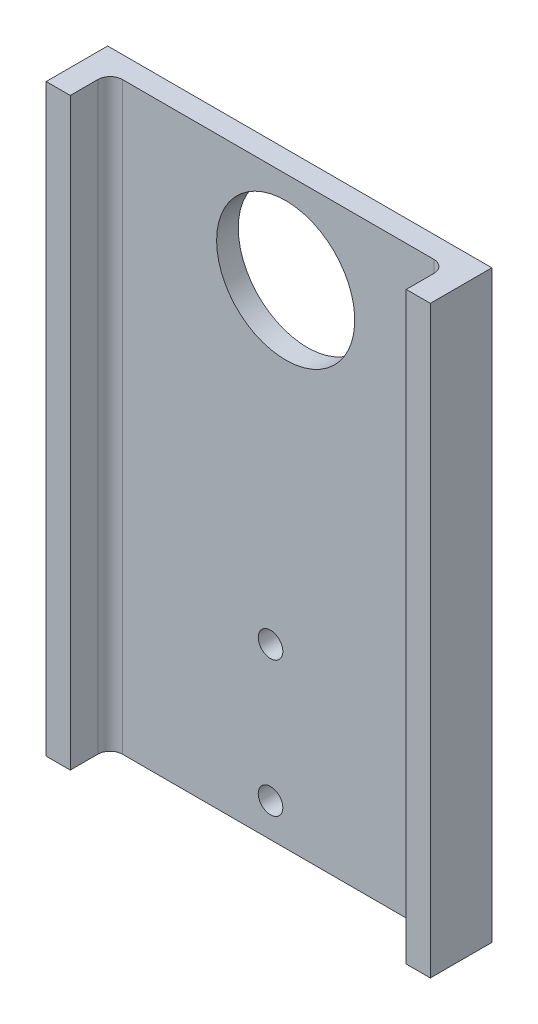
ISO-10303-21;
HEADER;
FILE_DESCRIPTION(('STEP AP214'),'2;1');
FILE_NAME('part.step','',(''),(''),'','','');
FILE_SCHEMA(('AUTOMOTIVE_DESIGN { 1 0 10303 214 1 1 1 1 }'));
ENDSEC;
DATA;
#1=APPLICATION_CONTEXT('core data for automotive mechanical design processes');
#2=APPLICATION_PROTOCOL_DEFINITION('international standard','automotive_design',2000,#1);
#3=PRODUCT_CONTEXT('',#1,'mechanical');
#4=PRODUCT('Part','Part','',(#3));
#5=PRODUCT_RELATED_PRODUCT_CATEGORY('part','',(#4));
#6=PRODUCT_DEFINITION_FORMATION('','',#4);
#7=PRODUCT_DEFINITION_CONTEXT('part definition',#1,'design');
#8=PRODUCT_DEFINITION('design','',#6,#7);
#9=PRODUCT_DEFINITION_SHAPE('','',#8);
#10=(LENGTH_UNIT() NAMED_UNIT(*) SI_UNIT(.MILLI.,.METRE.));
#11=(NAMED_UNIT(*) PLANE_ANGLE_UNIT() SI_UNIT($,.RADIAN.));
#12=(NAMED_UNIT(*) SI_UNIT($,.STERADIAN.) SOLID_ANGLE_UNIT());
#13=UNCERTAINTY_MEASURE_WITH_UNIT(LENGTH_MEASURE(1.E-05),#10,'distance_accuracy_value','');
#14=(GEOMETRIC_REPRESENTATION_CONTEXT(3) GLOBAL_UNCERTAINTY_ASSIGNED_CONTEXT((#13)) GLOBAL_UNIT_ASSIGNED_CONTEXT((#10,
#11,#12)) REPRESENTATION_CONTEXT('',''));
#15=CARTESIAN_POINT('',(0.,0.,0.));
#16=DIRECTION('',(0.,0.,1.));
#17=DIRECTION('',(1.,0.,0.));
#18=AXIS2_PLACEMENT_3D('',#15,#16,#17);
#19=CARTESIAN_POINT('',(-38.1,120.65,12.7));
#20=DIRECTION('',(1.,0.,0.));
#21=DIRECTION('',(0.,0.,-1.));
#22=AXIS2_PLACEMENT_3D('',#19,#20,#21);
#23=PLANE('',#22);
#24=DIRECTION('',(0.,0.,1.));
#25=VECTOR('',#24,1.);
#26=CARTESIAN_POINT('',(-38.1,0.,12.7));
#27=LINE('',#26,#25);
#28=CARTESIAN_POINT('',(-38.1,0.,0.));
#29=VERTEX_POINT('',#28);
#30=CARTESIAN_POINT('',(-38.1,0.,12.7));
#31=VERTEX_POINT('',#30);
#32=EDGE_CURVE('E193',#29,#31,#27,.T.);
#33=ORIENTED_EDGE('',*,*,#32,.T.);
#34=DIRECTION('',(0.,-1.,0.));
#35=VECTOR('',#34,1.);
#36=CARTESIAN_POINT('',(-38.1,120.65,12.7));
#37=LINE('',#36,#35);
#38=CARTESIAN_POINT('',(-38.1,120.65,12.7));
#39=VERTEX_POINT('',#38);
#40=EDGE_CURVE('E115',#39,#31,#37,.T.);
#41=ORIENTED_EDGE('',*,*,#40,.F.);
#42=DIRECTION('',(0.,0.,1.));
#43=VECTOR('',#42,1.);
#44=CARTESIAN_POINT('',(-38.1,120.65,12.7));
#45=LINE('',#44,#43);
#46=CARTESIAN_POINT('',(-38.1,120.65,0.));
#47=VERTEX_POINT('',#46);
#48=EDGE_CURVE('E110',#47,#39,#45,.T.);
#49=ORIENTED_EDGE('',*,*,#48,.F.);
#50=DIRECTION('',(0.,-1.,0.));
#51=VECTOR('',#50,1.);
#52=CARTESIAN_POINT('',(-38.1,120.65,0.));
#53=LINE('',#52,#51);
#54=EDGE_CURVE('E113',#47,#29,#53,.T.);
#55=ORIENTED_EDGE('',*,*,#54,.T.);
#56=EDGE_LOOP('',(#33,#41,#49,#55));
#57=FACE_BOUND('',#56,.T.);
#58=ADVANCED_FACE('F33',(#57),#23,.F.);
#59=CARTESIAN_POINT('',(-33.1216,120.65,12.7));
#60=DIRECTION('',(0.,0.,-1.));
#61=DIRECTION('',(-1.,0.,0.));
#62=AXIS2_PLACEMENT_3D('',#59,#60,#61);
#63=PLANE('',#62);
#64=DIRECTION('',(1.,0.,0.));
#65=VECTOR('',#64,1.);
#66=CARTESIAN_POINT('',(-33.1216,0.,12.7));
#67=LINE('',#66,#65);
#68=CARTESIAN_POINT('',(-33.1216,0.,12.7));
#69=VERTEX_POINT('',#68);
#70=EDGE_CURVE('E192',#31,#69,#67,.T.);
#71=ORIENTED_EDGE('',*,*,#70,.T.);
#72=DIRECTION('',(0.,-1.,0.));
#73=VECTOR('',#72,1.);
#74=CARTESIAN_POINT('',(-33.1216,120.65,12.7));
#75=LINE('',#74,#73);
#76=CARTESIAN_POINT('',(-33.1216,120.65,12.7));
#77=VERTEX_POINT('',#76);
#78=EDGE_CURVE('E138',#77,#69,#75,.T.);
#79=ORIENTED_EDGE('',*,*,#78,.F.);
#80=DIRECTION('',(1.,0.,0.));
#81=VECTOR('',#80,1.);
#82=CARTESIAN_POINT('',(-33.1216,120.65,12.7));
#83=LINE('',#82,#81);
#84=EDGE_CURVE('E118',#39,#77,#83,.T.);
#85=ORIENTED_EDGE('',*,*,#84,.F.);
#86=ORIENTED_EDGE('',*,*,#40,.T.);
#87=EDGE_LOOP('',(#71,#79,#85,#86));
#88=FACE_BOUND('',#87,.T.);
#89=ADVANCED_FACE('F250',(#88),#63,.F.);
#90=CARTESIAN_POINT('',(-33.1216,120.65,4.4704));
#91=DIRECTION('',(-1.,0.,0.));
#92=DIRECTION('',(0.,0.,1.));
#93=AXIS2_PLACEMENT_3D('',#90,#91,#92);
#94=PLANE('',#93);
#95=DIRECTION('',(0.,0.,-1.));
#96=VECTOR('',#95,1.);
#97=CARTESIAN_POINT('',(-33.1216,0.,4.4704));
#98=LINE('',#97,#96);
#99=CARTESIAN_POINT('',(-33.1216,0.,7.0104));
#100=VERTEX_POINT('',#99);
#101=EDGE_CURVE('E168',#69,#100,#98,.T.);
#102=ORIENTED_EDGE('',*,*,#101,.T.);
#103=DIRECTION('',(0.,-1.,0.));
#104=VECTOR('',#103,1.);
#105=CARTESIAN_POINT('',(-33.1216,120.65,7.0104));
#106=LINE('',#105,#104);
#107=CARTESIAN_POINT('',(-33.1216,120.65,7.0104));
#108=VERTEX_POINT('',#107);
#109=EDGE_CURVE('E136',#100,#108,#106,.F.);
#110=ORIENTED_EDGE('',*,*,#109,.T.);
#111=DIRECTION('',(0.,0.,-1.));
#112=VECTOR('',#111,1.);
#113=CARTESIAN_POINT('',(-33.1216,120.65,4.4704));
#114=LINE('',#113,#112);
#115=EDGE_CURVE('E189',#77,#108,#114,.T.);
#116=ORIENTED_EDGE('',*,*,#115,.F.);
#117=ORIENTED_EDGE('',*,*,#78,.T.);
#118=EDGE_LOOP('',(#102,#110,#116,#117));
#119=FACE_BOUND('',#118,.T.);
#120=ADVANCED_FACE('F186',(#119),#94,.F.);
#121=CARTESIAN_POINT('',(36.2481188582486,120.65,4.47039999999999));
#122=DIRECTION('',(0.,0.,-1.));
#123=DIRECTION('',(-1.,0.,0.));
#124=AXIS2_PLACEMENT_3D('',#121,#122,#123);
#125=PLANE('',#124);
#126=CARTESIAN_POINT('',(0.,6.985,4.47039999999999));
#127=DIRECTION('',(0.,0.,-1.));
#128=DIRECTION('',(-1.,0.,0.));
#129=AXIS2_PLACEMENT_3D('',#126,#127,#128);
#130=CIRCLE('',#129,2.54);
#131=CARTESIAN_POINT('',(-2.54,6.985,4.47039999999999));
#132=VERTEX_POINT('',#131);
#133=EDGE_CURVE('E217',#132,#132,#130,.T.);
#134=ORIENTED_EDGE('',*,*,#133,.T.);
#135=EDGE_LOOP('',(#134));
#136=FACE_BOUND('',#135,.T.);
#137=CARTESIAN_POINT('',(0.,34.925,4.47039999999999));
#138=DIRECTION('',(0.,0.,-1.));
#139=DIRECTION('',(-1.,0.,0.));
#140=AXIS2_PLACEMENT_3D('',#137,#138,#139);
#141=CIRCLE('',#140,2.54);
#142=CARTESIAN_POINT('',(-2.54,34.925,4.47039999999999));
#143=VERTEX_POINT('',#142);
#144=EDGE_CURVE('E211',#143,#143,#141,.T.);
#145=ORIENTED_EDGE('',*,*,#144,.T.);
#146=EDGE_LOOP('',(#145));
#147=FACE_BOUND('',#146,.T.);
#148=CARTESIAN_POINT('',(3.12651885824855,101.6,4.47039999999999));
#149=DIRECTION('',(0.,0.,-1.));
#150=DIRECTION('',(-1.,0.,0.));
#151=AXIS2_PLACEMENT_3D('',#148,#149,#150);
#152=CIRCLE('',#151,14.2621);
#153=CARTESIAN_POINT('',(-11.1355811417514,101.6,4.47039999999999));
#154=VERTEX_POINT('',#153);
#155=EDGE_CURVE('E197',#154,#154,#152,.T.);
#156=ORIENTED_EDGE('',*,*,#155,.T.);
#157=EDGE_LOOP('',(#156));
#158=FACE_BOUND('',#157,.T.);
#159=DIRECTION('',(1.,0.,0.));
#160=VECTOR('',#159,1.);
#161=CARTESIAN_POINT('',(36.2481188582486,0.,4.47039999999999));
#162=LINE('',#161,#160);
#163=CARTESIAN_POINT('',(-30.5816,0.,4.4704));
#164=VERTEX_POINT('',#163);
#165=CARTESIAN_POINT('',(33.7081188582486,0.,4.47039999999999));
#166=VERTEX_POINT('',#165);
#167=EDGE_CURVE('E164',#164,#166,#162,.T.);
#168=ORIENTED_EDGE('',*,*,#167,.T.);
#169=DIRECTION('',(0.,-1.,0.));
#170=VECTOR('',#169,1.);
#171=CARTESIAN_POINT('',(33.7081188582486,120.65,4.47039999999999));
#172=LINE('',#171,#170);
#173=CARTESIAN_POINT('',(33.7081188582486,120.65,4.47039999999999));
#174=VERTEX_POINT('',#173);
#175=EDGE_CURVE('E54',#166,#174,#172,.F.);
#176=ORIENTED_EDGE('',*,*,#175,.T.);
#177=DIRECTION('',(1.,0.,0.));
#178=VECTOR('',#177,1.);
#179=CARTESIAN_POINT('',(0.,120.65,4.47039999999999));
#180=LINE('',#179,#178);
#181=CARTESIAN_POINT('',(-30.5816,120.65,4.4704));
#182=VERTEX_POINT('',#181);
#183=EDGE_CURVE('E202',#182,#174,#180,.T.);
#184=ORIENTED_EDGE('',*,*,#183,.F.);
#185=DIRECTION('',(0.,-1.,0.));
#186=VECTOR('',#185,1.);
#187=CARTESIAN_POINT('',(-30.5816,0.,4.4704));
#188=LINE('',#187,#186);
#189=EDGE_CURVE('E133',#182,#164,#188,.T.);
#190=ORIENTED_EDGE('',*,*,#189,.T.);
#191=EDGE_LOOP('',(#168,#176,#184,#190));
#192=FACE_BOUND('',#191,.T.);
#193=ADVANCED_FACE('F242',(#136,#147,#158,#192),#125,.F.);
#194=CARTESIAN_POINT('',(36.2481188582486,120.65,12.7));
#195=DIRECTION('',(1.,0.,0.));
#196=DIRECTION('',(0.,0.,-1.));
#197=AXIS2_PLACEMENT_3D('',#194,#195,#196);
#198=PLANE('',#197);
#199=DIRECTION('',(0.,0.,1.));
#200=VECTOR('',#199,1.);
#201=CARTESIAN_POINT('',(36.2481188582486,120.65,12.7));
#202=LINE('',#201,#200);
#203=CARTESIAN_POINT('',(36.2481188582486,120.65,7.01039999999999));
#204=VERTEX_POINT('',#203);
#205=CARTESIAN_POINT('',(36.2481188582486,120.65,12.7));
#206=VERTEX_POINT('',#205);
#207=EDGE_CURVE('E157',#204,#206,#202,.T.);
#208=ORIENTED_EDGE('',*,*,#207,.F.);
#209=DIRECTION('',(0.,-1.,0.));
#210=VECTOR('',#209,1.);
#211=CARTESIAN_POINT('',(36.2481188582486,0.,7.01039999999999));
#212=LINE('',#211,#210);
#213=CARTESIAN_POINT('',(36.2481188582486,0.,7.01039999999999));
#214=VERTEX_POINT('',#213);
#215=EDGE_CURVE('E147',#204,#214,#212,.T.);
#216=ORIENTED_EDGE('',*,*,#215,.T.);
#217=DIRECTION('',(0.,0.,1.));
#218=VECTOR('',#217,1.);
#219=CARTESIAN_POINT('',(36.2481188582486,0.,12.7));
#220=LINE('',#219,#218);
#221=CARTESIAN_POINT('',(36.2481188582486,0.,12.7));
#222=VERTEX_POINT('',#221);
#223=EDGE_CURVE('E155',#214,#222,#220,.T.);
#224=ORIENTED_EDGE('',*,*,#223,.T.);
#225=DIRECTION('',(0.,-1.,0.));
#226=VECTOR('',#225,1.);
#227=CARTESIAN_POINT('',(36.2481188582486,120.65,12.7));
#228=LINE('',#227,#226);
#229=EDGE_CURVE('E179',#206,#222,#228,.T.);
#230=ORIENTED_EDGE('',*,*,#229,.F.);
#231=EDGE_LOOP('',(#208,#216,#224,#230));
#232=FACE_BOUND('',#231,.T.);
#233=ADVANCED_FACE('F153',(#232),#198,.F.);
#234=CARTESIAN_POINT('',(41.2265188582486,120.65,12.7));
#235=DIRECTION('',(0.,0.,-1.));
#236=DIRECTION('',(-1.,0.,0.));
#237=AXIS2_PLACEMENT_3D('',#234,#235,#236);
#238=PLANE('',#237);
#239=DIRECTION('',(1.,0.,0.));
#240=VECTOR('',#239,1.);
#241=CARTESIAN_POINT('',(41.2265188582486,0.,12.7));
#242=LINE('',#241,#240);
#243=CARTESIAN_POINT('',(41.2265188582486,0.,12.7));
#244=VERTEX_POINT('',#243);
#245=EDGE_CURVE('E163',#222,#244,#242,.T.);
#246=ORIENTED_EDGE('',*,*,#245,.T.);
#247=DIRECTION('',(0.,-1.,0.));
#248=VECTOR('',#247,1.);
#249=CARTESIAN_POINT('',(41.2265188582486,120.65,12.7));
#250=LINE('',#249,#248);
#251=CARTESIAN_POINT('',(41.2265188582486,120.65,12.7));
#252=VERTEX_POINT('',#251);
#253=EDGE_CURVE('E176',#252,#244,#250,.T.);
#254=ORIENTED_EDGE('',*,*,#253,.F.);
#255=DIRECTION('',(1.,0.,0.));
#256=VECTOR('',#255,1.);
#257=CARTESIAN_POINT('',(41.2265188582486,120.65,12.7));
#258=LINE('',#257,#256);
#259=EDGE_CURVE('E199',#206,#252,#258,.T.);
#260=ORIENTED_EDGE('',*,*,#259,.F.);
#261=ORIENTED_EDGE('',*,*,#229,.T.);
#262=EDGE_LOOP('',(#246,#254,#260,#261));
#263=FACE_BOUND('',#262,.T.);
#264=ADVANCED_FACE('F277',(#263),#238,.F.);
#265=CARTESIAN_POINT('',(41.2265188582486,120.65,0.));
#266=DIRECTION('',(-1.,0.,0.));
#267=DIRECTION('',(0.,0.,1.));
#268=AXIS2_PLACEMENT_3D('',#265,#266,#267);
#269=PLANE('',#268);
#270=DIRECTION('',(0.,0.,-1.));
#271=VECTOR('',#270,1.);
#272=CARTESIAN_POINT('',(41.2265188582486,0.,0.));
#273=LINE('',#272,#271);
#274=CARTESIAN_POINT('',(41.2265188582486,0.,0.));
#275=VERTEX_POINT('',#274);
#276=EDGE_CURVE('E166',#244,#275,#273,.T.);
#277=ORIENTED_EDGE('',*,*,#276,.T.);
#278=DIRECTION('',(0.,-1.,0.));
#279=VECTOR('',#278,1.);
#280=CARTESIAN_POINT('',(41.2265188582486,120.65,0.));
#281=LINE('',#280,#279);
#282=CARTESIAN_POINT('',(41.2265188582486,120.65,0.));
#283=VERTEX_POINT('',#282);
#284=EDGE_CURVE('E174',#283,#275,#281,.T.);
#285=ORIENTED_EDGE('',*,*,#284,.F.);
#286=DIRECTION('',(0.,0.,-1.));
#287=VECTOR('',#286,1.);
#288=CARTESIAN_POINT('',(41.2265188582486,120.65,0.));
#289=LINE('',#288,#287);
#290=EDGE_CURVE('E124',#252,#283,#289,.T.);
#291=ORIENTED_EDGE('',*,*,#290,.F.);
#292=ORIENTED_EDGE('',*,*,#253,.T.);
#293=EDGE_LOOP('',(#277,#285,#291,#292));
#294=FACE_BOUND('',#293,.T.);
#295=ADVANCED_FACE('F229',(#294),#269,.F.);
#296=CARTESIAN_POINT('',(0.,120.65,0.));
#297=DIRECTION('',(0.,0.,1.));
#298=DIRECTION('',(1.,0.,0.));
#299=AXIS2_PLACEMENT_3D('',#296,#297,#298);
#300=PLANE('',#299);
#301=CARTESIAN_POINT('',(0.,6.985,0.));
#302=DIRECTION('',(0.,0.,-1.));
#303=DIRECTION('',(-1.,0.,0.));
#304=AXIS2_PLACEMENT_3D('',#301,#302,#303);
#305=CIRCLE('',#304,2.54);
#306=CARTESIAN_POINT('',(-2.54,6.985,0.));
#307=VERTEX_POINT('',#306);
#308=EDGE_CURVE('E220',#307,#307,#305,.T.);
#309=ORIENTED_EDGE('',*,*,#308,.F.);
#310=EDGE_LOOP('',(#309));
#311=FACE_BOUND('',#310,.T.);
#312=CARTESIAN_POINT('',(0.,34.925,0.));
#313=DIRECTION('',(0.,0.,-1.));
#314=DIRECTION('',(-1.,0.,0.));
#315=AXIS2_PLACEMENT_3D('',#312,#313,#314);
#316=CIRCLE('',#315,2.54);
#317=CARTESIAN_POINT('',(-2.54,34.925,0.));
#318=VERTEX_POINT('',#317);
#319=EDGE_CURVE('E214',#318,#318,#316,.T.);
#320=ORIENTED_EDGE('',*,*,#319,.F.);
#321=EDGE_LOOP('',(#320));
#322=FACE_BOUND('',#321,.T.);
#323=CARTESIAN_POINT('',(3.12651885824855,101.6,0.));
#324=DIRECTION('',(0.,0.,-1.));
#325=DIRECTION('',(-1.,0.,0.));
#326=AXIS2_PLACEMENT_3D('',#323,#324,#325);
#327=CIRCLE('',#326,14.2621);
#328=CARTESIAN_POINT('',(-11.1355811417514,101.6,0.));
#329=VERTEX_POINT('',#328);
#330=EDGE_CURVE('E208',#329,#329,#327,.T.);
#331=ORIENTED_EDGE('',*,*,#330,.F.);
#332=EDGE_LOOP('',(#331));
#333=FACE_BOUND('',#332,.T.);
#334=DIRECTION('',(-1.,0.,0.));
#335=VECTOR('',#334,1.);
#336=CARTESIAN_POINT('',(0.,0.,0.));
#337=LINE('',#336,#335);
#338=EDGE_CURVE('E128',#275,#29,#337,.T.);
#339=ORIENTED_EDGE('',*,*,#338,.T.);
#340=ORIENTED_EDGE('',*,*,#54,.F.);
#341=DIRECTION('',(-1.,0.,0.));
#342=VECTOR('',#341,1.);
#343=CARTESIAN_POINT('',(-38.1,120.65,0.));
#344=LINE('',#343,#342);
#345=EDGE_CURVE('E119',#283,#47,#344,.T.);
#346=ORIENTED_EDGE('',*,*,#345,.F.);
#347=ORIENTED_EDGE('',*,*,#284,.T.);
#348=EDGE_LOOP('',(#339,#340,#346,#347));
#349=FACE_BOUND('',#348,.T.);
#350=ADVANCED_FACE('F130',(#311,#322,#333,#349),#300,.F.);
#351=CARTESIAN_POINT('',(0.,120.65,0.));
#352=DIRECTION('',(0.,-1.,0.));
#353=DIRECTION('',(0.,0.,-1.));
#354=AXIS2_PLACEMENT_3D('',#351,#352,#353);
#355=PLANE('',#354);
#356=ORIENTED_EDGE('',*,*,#345,.T.);
#357=ORIENTED_EDGE('',*,*,#48,.T.);
#358=ORIENTED_EDGE('',*,*,#84,.T.);
#359=ORIENTED_EDGE('',*,*,#115,.T.);
#360=CARTESIAN_POINT('',(-30.5816,120.65,7.0104));
#361=DIRECTION('',(0.,-1.,0.));
#362=DIRECTION('',(0.,0.,-1.));
#363=AXIS2_PLACEMENT_3D('',#360,#361,#362);
#364=CIRCLE('',#363,2.54);
#365=EDGE_CURVE('E145',#108,#182,#364,.T.);
#366=ORIENTED_EDGE('',*,*,#365,.T.);
#367=ORIENTED_EDGE('',*,*,#183,.T.);
#368=CARTESIAN_POINT('',(33.7081188582486,120.65,7.01039999999999));
#369=DIRECTION('',(0.,-1.,0.));
#370=DIRECTION('',(0.,0.,-1.));
#371=AXIS2_PLACEMENT_3D('',#368,#369,#370);
#372=CIRCLE('',#371,2.54);
#373=EDGE_CURVE('E11',#174,#204,#372,.T.);
#374=ORIENTED_EDGE('',*,*,#373,.T.);
#375=ORIENTED_EDGE('',*,*,#207,.T.);
#376=ORIENTED_EDGE('',*,*,#259,.T.);
#377=ORIENTED_EDGE('',*,*,#290,.T.);
#378=EDGE_LOOP('',(#356,#357,#358,#359,#366,#367,#374,#375,#376,#377));
#379=FACE_BOUND('',#378,.T.);
#380=ADVANCED_FACE('F122',(#379),#355,.F.);
#381=CARTESIAN_POINT('',(0.,0.,0.));
#382=DIRECTION('',(0.,-1.,0.));
#383=DIRECTION('',(0.,0.,-1.));
#384=AXIS2_PLACEMENT_3D('',#381,#382,#383);
#385=PLANE('',#384);
#386=ORIENTED_EDGE('',*,*,#32,.F.);
#387=ORIENTED_EDGE('',*,*,#338,.F.);
#388=ORIENTED_EDGE('',*,*,#276,.F.);
#389=ORIENTED_EDGE('',*,*,#245,.F.);
#390=ORIENTED_EDGE('',*,*,#223,.F.);
#391=CARTESIAN_POINT('',(33.7081188582486,0.,7.01039999999999));
#392=DIRECTION('',(0.,-1.,0.));
#393=DIRECTION('',(0.,0.,-1.));
#394=AXIS2_PLACEMENT_3D('',#391,#392,#393);
#395=CIRCLE('',#394,2.54);
#396=EDGE_CURVE('E41',#214,#166,#395,.F.);
#397=ORIENTED_EDGE('',*,*,#396,.T.);
#398=ORIENTED_EDGE('',*,*,#167,.F.);
#399=CARTESIAN_POINT('',(-30.5816,0.,7.0104));
#400=DIRECTION('',(0.,-1.,0.));
#401=DIRECTION('',(0.,0.,-1.));
#402=AXIS2_PLACEMENT_3D('',#399,#400,#401);
#403=CIRCLE('',#402,2.54);
#404=EDGE_CURVE('E143',#164,#100,#403,.F.);
#405=ORIENTED_EDGE('',*,*,#404,.T.);
#406=ORIENTED_EDGE('',*,*,#101,.F.);
#407=ORIENTED_EDGE('',*,*,#70,.F.);
#408=EDGE_LOOP('',(#386,#387,#388,#389,#390,#397,#398,#405,#406,#407));
#409=FACE_BOUND('',#408,.T.);
#410=ADVANCED_FACE('F161',(#409),#385,.T.);
#411=CARTESIAN_POINT('',(3.12651885824855,101.6,107.95));
#412=DIRECTION('',(0.,0.,-1.));
#413=DIRECTION('',(-1.,0.,0.));
#414=AXIS2_PLACEMENT_3D('',#411,#412,#413);
#415=CYLINDRICAL_SURFACE('',#414,14.2621);
#416=ORIENTED_EDGE('',*,*,#330,.T.);
#417=EDGE_LOOP('',(#416));
#418=FACE_BOUND('',#417,.T.);
#419=ORIENTED_EDGE('',*,*,#155,.F.);
#420=EDGE_LOOP('',(#419));
#421=FACE_BOUND('',#420,.T.);
#422=ADVANCED_FACE('F235',(#418,#421),#415,.F.);
#423=CARTESIAN_POINT('',(0.,34.925,127.));
#424=DIRECTION('',(0.,0.,-1.));
#425=DIRECTION('',(-1.,0.,0.));
#426=AXIS2_PLACEMENT_3D('',#423,#424,#425);
#427=CYLINDRICAL_SURFACE('',#426,2.54);
#428=ORIENTED_EDGE('',*,*,#319,.T.);
#429=EDGE_LOOP('',(#428));
#430=FACE_BOUND('',#429,.T.);
#431=ORIENTED_EDGE('',*,*,#144,.F.);
#432=EDGE_LOOP('',(#431));
#433=FACE_BOUND('',#432,.T.);
#434=ADVANCED_FACE('F238',(#430,#433),#427,.F.);
#435=CARTESIAN_POINT('',(0.,6.985,127.));
#436=DIRECTION('',(0.,0.,-1.));
#437=DIRECTION('',(-1.,0.,0.));
#438=AXIS2_PLACEMENT_3D('',#435,#436,#437);
#439=CYLINDRICAL_SURFACE('',#438,2.54);
#440=ORIENTED_EDGE('',*,*,#308,.T.);
#441=EDGE_LOOP('',(#440));
#442=FACE_BOUND('',#441,.T.);
#443=ORIENTED_EDGE('',*,*,#133,.F.);
#444=EDGE_LOOP('',(#443));
#445=FACE_BOUND('',#444,.T.);
#446=ADVANCED_FACE('F224',(#442,#445),#439,.F.);
#447=CARTESIAN_POINT('',(-30.5816,120.65,7.0104));
#448=DIRECTION('',(0.,1.,0.));
#449=DIRECTION('',(0.,0.,1.));
#450=AXIS2_PLACEMENT_3D('',#447,#448,#449);
#451=CYLINDRICAL_SURFACE('',#450,2.54);
#452=ORIENTED_EDGE('',*,*,#365,.F.);
#453=ORIENTED_EDGE('',*,*,#109,.F.);
#454=ORIENTED_EDGE('',*,*,#404,.F.);
#455=ORIENTED_EDGE('',*,*,#189,.F.);
#456=EDGE_LOOP('',(#452,#453,#454,#455));
#457=FACE_BOUND('',#456,.T.);
#458=ADVANCED_FACE('F249',(#457),#451,.F.);
#459=CARTESIAN_POINT('',(33.7081188582486,120.65,7.01039999999999));
#460=DIRECTION('',(0.,1.,0.));
#461=DIRECTION('',(0.,0.,1.));
#462=AXIS2_PLACEMENT_3D('',#459,#460,#461);
#463=CYLINDRICAL_SURFACE('',#462,2.54);
#464=ORIENTED_EDGE('',*,*,#373,.F.);
#465=ORIENTED_EDGE('',*,*,#175,.F.);
#466=ORIENTED_EDGE('',*,*,#396,.F.);
#467=ORIENTED_EDGE('',*,*,#215,.F.);
#468=EDGE_LOOP('',(#464,#465,#466,#467));
#469=FACE_BOUND('',#468,.T.);
#470=ADVANCED_FACE('F35',(#469),#463,.F.);
#471=CLOSED_SHELL('',(#58,#89,#120,#193,#233,#264,#295,#350,#380,#410,#422,#434,#446,#458,#470));
#472=MANIFOLD_SOLID_BREP('B2',#471);
#473=ADVANCED_BREP_SHAPE_REPRESENTATION('',(#18,#472),#14);
#474=SHAPE_DEFINITION_REPRESENTATION(#9,#473);
ENDSEC;
END-ISO-10303-21;
